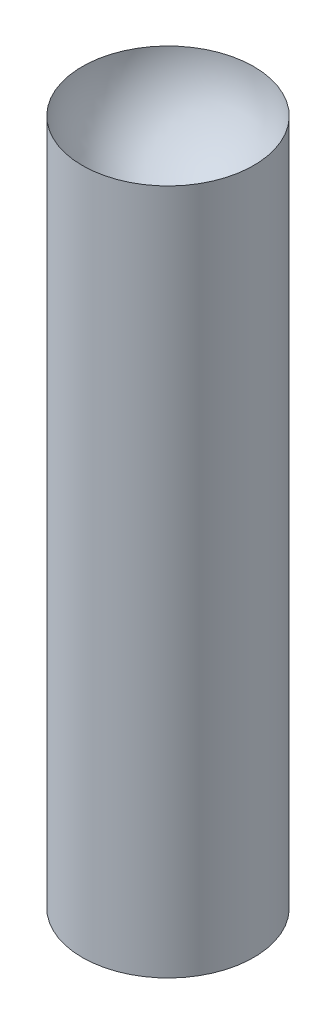
ISO-10303-21;
HEADER;
FILE_DESCRIPTION(('STEP AP214'),'2;1');
FILE_NAME('part.step','',(''),(''),'','','');
FILE_SCHEMA(('AUTOMOTIVE_DESIGN { 1 0 10303 214 1 1 1 1 }'));
ENDSEC;
DATA;
#1=APPLICATION_CONTEXT('core data for automotive mechanical design processes');
#2=APPLICATION_PROTOCOL_DEFINITION('international standard','automotive_design',2000,#1);
#3=PRODUCT_CONTEXT('',#1,'mechanical');
#4=PRODUCT('Part','Part','',(#3));
#5=PRODUCT_RELATED_PRODUCT_CATEGORY('part','',(#4));
#6=PRODUCT_DEFINITION_FORMATION('','',#4);
#7=PRODUCT_DEFINITION_CONTEXT('part definition',#1,'design');
#8=PRODUCT_DEFINITION('design','',#6,#7);
#9=PRODUCT_DEFINITION_SHAPE('','',#8);
#10=(LENGTH_UNIT() NAMED_UNIT(*) SI_UNIT(.MILLI.,.METRE.));
#11=(NAMED_UNIT(*) PLANE_ANGLE_UNIT() SI_UNIT($,.RADIAN.));
#12=(NAMED_UNIT(*) SI_UNIT($,.STERADIAN.) SOLID_ANGLE_UNIT());
#13=UNCERTAINTY_MEASURE_WITH_UNIT(LENGTH_MEASURE(1.E-05),#10,'distance_accuracy_value','');
#14=(GEOMETRIC_REPRESENTATION_CONTEXT(3) GLOBAL_UNCERTAINTY_ASSIGNED_CONTEXT((#13)) GLOBAL_UNIT_ASSIGNED_CONTEXT((#10,
#11,#12)) REPRESENTATION_CONTEXT('',''));
#15=CARTESIAN_POINT('',(0.,0.,0.));
#16=DIRECTION('',(0.,0.,1.));
#17=DIRECTION('',(1.,0.,0.));
#18=AXIS2_PLACEMENT_3D('',#15,#16,#17);
#19=CARTESIAN_POINT('',(0.,101.6,0.));
#20=DIRECTION('',(0.,-1.,0.));
#21=DIRECTION('',(0.,0.,-1.));
#22=AXIS2_PLACEMENT_3D('',#19,#20,#21);
#23=CYLINDRICAL_SURFACE('',#22,12.7);
#24=CARTESIAN_POINT('',(0.,101.6,0.));
#25=DIRECTION('',(0.,1.,0.));
#26=DIRECTION('',(0.,0.,1.));
#27=AXIS2_PLACEMENT_3D('',#24,#25,#26);
#28=CIRCLE('',#27,12.7);
#29=CARTESIAN_POINT('',(0.,101.6,12.7));
#30=VERTEX_POINT('',#29);
#31=EDGE_CURVE('E38',#30,#30,#28,.T.);
#32=ORIENTED_EDGE('',*,*,#31,.F.);
#33=EDGE_LOOP('',(#32));
#34=FACE_BOUND('',#33,.T.);
#35=CARTESIAN_POINT('',(0.,0.,0.));
#36=DIRECTION('',(0.,1.,0.));
#37=DIRECTION('',(0.,0.,1.));
#38=AXIS2_PLACEMENT_3D('',#35,#36,#37);
#39=CIRCLE('',#38,12.7);
#40=CARTESIAN_POINT('',(0.,0.,12.7));
#41=VERTEX_POINT('',#40);
#42=EDGE_CURVE('E10',#41,#41,#39,.T.);
#43=ORIENTED_EDGE('',*,*,#42,.T.);
#44=EDGE_LOOP('',(#43));
#45=FACE_BOUND('',#44,.T.);
#46=ADVANCED_FACE('F31',(#34,#45),#23,.T.);
#47=CARTESIAN_POINT('',(0.,0.,0.));
#48=DIRECTION('',(0.,1.,0.));
#49=DIRECTION('',(0.,0.,1.));
#50=AXIS2_PLACEMENT_3D('',#47,#48,#49);
#51=PLANE('',#50);
#52=CARTESIAN_POINT('',(0.,0.,0.));
#53=DIRECTION('',(0.,1.,0.));
#54=DIRECTION('',(0.,0.,1.));
#55=AXIS2_PLACEMENT_3D('',#52,#53,#54);
#56=CIRCLE('',#55,11.43);
#57=CARTESIAN_POINT('',(0.,0.,11.43));
#58=VERTEX_POINT('',#57);
#59=EDGE_CURVE('E34',#58,#58,#56,.F.);
#60=ORIENTED_EDGE('',*,*,#59,.F.);
#61=EDGE_LOOP('',(#60));
#62=FACE_BOUND('',#61,.T.);
#63=ORIENTED_EDGE('',*,*,#42,.F.);
#64=EDGE_LOOP('',(#63));
#65=FACE_BOUND('',#64,.T.);
#66=ADVANCED_FACE('F50',(#62,#65),#51,.F.);
#67=CARTESIAN_POINT('',(0.,101.6,0.));
#68=DIRECTION('',(0.,0.,-1.));
#69=DIRECTION('',(1.,0.,0.));
#70=AXIS2_PLACEMENT_3D('',#67,#68,#69);
#71=SPHERICAL_SURFACE('',#70,12.7);
#72=CARTESIAN_POINT('',(0.,101.6,0.));
#73=DIRECTION('',(0.,1.,0.));
#74=DIRECTION('',(0.,0.,1.));
#75=AXIS2_PLACEMENT_3D('',#72,#73,#74);
#76=SPHERICAL_SURFACE('',#75,12.7);
#77=ORIENTED_EDGE('',*,*,#31,.T.);
#78=EDGE_LOOP('',(#77));
#79=FACE_BOUND('',#78,.T.);
#80=ADVANCED_FACE('F53',(#79),#76,.F.);
#81=CARTESIAN_POINT('',(0.,0.,0.));
#82=DIRECTION('',(0.,0.,-1.));
#83=DIRECTION('',(-1.,0.,0.));
#84=AXIS2_PLACEMENT_3D('',#81,#82,#83);
#85=SPHERICAL_SURFACE('',#84,11.43);
#86=CARTESIAN_POINT('',(0.,0.,0.));
#87=DIRECTION('',(0.,1.,0.));
#88=DIRECTION('',(0.,0.,1.));
#89=AXIS2_PLACEMENT_3D('',#86,#87,#88);
#90=SPHERICAL_SURFACE('',#89,11.43);
#91=ORIENTED_EDGE('',*,*,#59,.T.);
#92=EDGE_LOOP('',(#91));
#93=FACE_BOUND('',#92,.T.);
#94=ADVANCED_FACE('F48',(#93),#90,.F.);
#95=CLOSED_SHELL('',(#46,#66,#80,#94));
#96=MANIFOLD_SOLID_BREP('B2',#95);
#97=ADVANCED_BREP_SHAPE_REPRESENTATION('',(#18,#96),#14);
#98=SHAPE_DEFINITION_REPRESENTATION(#9,#97);
ENDSEC;
END-ISO-10303-21;
